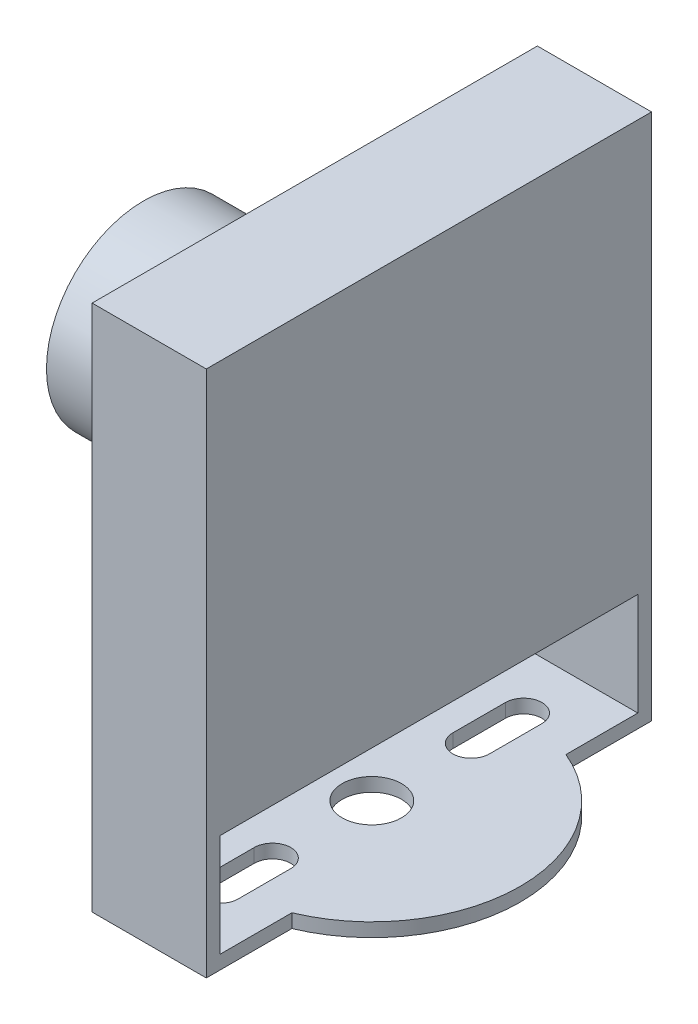
ISO-10303-21;
HEADER;
FILE_DESCRIPTION(('STEP AP214'),'2;1');
FILE_NAME('part.step','',(''),(''),'','','');
FILE_SCHEMA(('AUTOMOTIVE_DESIGN { 1 0 10303 214 1 1 1 1 }'));
ENDSEC;
DATA;
#1=APPLICATION_CONTEXT('core data for automotive mechanical design processes');
#2=APPLICATION_PROTOCOL_DEFINITION('international standard','automotive_design',2000,#1);
#3=PRODUCT_CONTEXT('',#1,'mechanical');
#4=PRODUCT('Part','Part','',(#3));
#5=PRODUCT_RELATED_PRODUCT_CATEGORY('part','',(#4));
#6=PRODUCT_DEFINITION_FORMATION('','',#4);
#7=PRODUCT_DEFINITION_CONTEXT('part definition',#1,'design');
#8=PRODUCT_DEFINITION('design','',#6,#7);
#9=PRODUCT_DEFINITION_SHAPE('','',#8);
#10=(LENGTH_UNIT() NAMED_UNIT(*) SI_UNIT(.MILLI.,.METRE.));
#11=(NAMED_UNIT(*) PLANE_ANGLE_UNIT() SI_UNIT($,.RADIAN.));
#12=(NAMED_UNIT(*) SI_UNIT($,.STERADIAN.) SOLID_ANGLE_UNIT());
#13=UNCERTAINTY_MEASURE_WITH_UNIT(LENGTH_MEASURE(1.E-05),#10,'distance_accuracy_value','');
#14=(GEOMETRIC_REPRESENTATION_CONTEXT(3) GLOBAL_UNCERTAINTY_ASSIGNED_CONTEXT((#13)) GLOBAL_UNIT_ASSIGNED_CONTEXT((#10,
#11,#12)) REPRESENTATION_CONTEXT('',''));
#15=CARTESIAN_POINT('',(0.,0.,0.));
#16=DIRECTION('',(0.,0.,1.));
#17=DIRECTION('',(1.,0.,0.));
#18=AXIS2_PLACEMENT_3D('',#15,#16,#17);
#19=CARTESIAN_POINT('',(-5.,0.,19.5));
#20=DIRECTION('',(-1.,0.,0.));
#21=DIRECTION('',(0.,0.,1.));
#22=AXIS2_PLACEMENT_3D('',#19,#20,#21);
#23=PLANE('',#22);
#24=DIRECTION('',(0.,-1.,0.));
#25=VECTOR('',#24,1.);
#26=CARTESIAN_POINT('',(-5.,1.2,-12.));
#27=LINE('',#26,#25);
#28=CARTESIAN_POINT('',(-5.,1.2,-12.));
#29=VERTEX_POINT('',#28);
#30=CARTESIAN_POINT('',(-5.,0.,-12.));
#31=VERTEX_POINT('',#30);
#32=EDGE_CURVE('E435',#29,#31,#27,.T.);
#33=ORIENTED_EDGE('',*,*,#32,.F.);
#34=DIRECTION('',(0.,0.,1.));
#35=VECTOR('',#34,1.);
#36=CARTESIAN_POINT('',(-5.,1.2,19.5));
#37=LINE('',#36,#35);
#38=CARTESIAN_POINT('',(-5.,1.2,-18.3));
#39=VERTEX_POINT('',#38);
#40=EDGE_CURVE('E415',#39,#29,#37,.T.);
#41=ORIENTED_EDGE('',*,*,#40,.F.);
#42=DIRECTION('',(0.,-1.,0.));
#43=VECTOR('',#42,1.);
#44=CARTESIAN_POINT('',(-5.,46.2,-18.3));
#45=LINE('',#44,#43);
#46=CARTESIAN_POINT('',(-4.99999999999999,10.2,-18.3));
#47=VERTEX_POINT('',#46);
#48=EDGE_CURVE('E390',#47,#39,#45,.T.);
#49=ORIENTED_EDGE('',*,*,#48,.F.);
#50=DIRECTION('',(0.,0.,-1.));
#51=VECTOR('',#50,1.);
#52=CARTESIAN_POINT('',(-4.99999999999999,10.2,55.6630833845388));
#53=LINE('',#52,#51);
#54=CARTESIAN_POINT('',(-5.,10.2,18.3));
#55=VERTEX_POINT('',#54);
#56=EDGE_CURVE('E350',#55,#47,#53,.T.);
#57=ORIENTED_EDGE('',*,*,#56,.F.);
#58=DIRECTION('',(0.,-1.,0.));
#59=VECTOR('',#58,1.);
#60=CARTESIAN_POINT('',(-5.,46.2,18.3));
#61=LINE('',#60,#59);
#62=CARTESIAN_POINT('',(-5.,1.2,18.3));
#63=VERTEX_POINT('',#62);
#64=EDGE_CURVE('E363',#55,#63,#61,.T.);
#65=ORIENTED_EDGE('',*,*,#64,.T.);
#66=CARTESIAN_POINT('',(-5.,1.2,12.));
#67=VERTEX_POINT('',#66);
#68=EDGE_CURVE('E414',#67,#63,#37,.T.);
#69=ORIENTED_EDGE('',*,*,#68,.F.);
#70=DIRECTION('',(0.,-1.,0.));
#71=VECTOR('',#70,1.);
#72=CARTESIAN_POINT('',(-5.,1.2,12.));
#73=LINE('',#72,#71);
#74=CARTESIAN_POINT('',(-5.,0.,12.));
#75=VERTEX_POINT('',#74);
#76=EDGE_CURVE('E422',#75,#67,#73,.F.);
#77=ORIENTED_EDGE('',*,*,#76,.F.);
#78=DIRECTION('',(0.,0.,1.));
#79=VECTOR('',#78,1.);
#80=CARTESIAN_POINT('',(-5.,0.,19.5));
#81=LINE('',#80,#79);
#82=CARTESIAN_POINT('',(-5.,0.,19.5));
#83=VERTEX_POINT('',#82);
#84=EDGE_CURVE('E402',#75,#83,#81,.T.);
#85=ORIENTED_EDGE('',*,*,#84,.T.);
#86=DIRECTION('',(0.,1.,0.));
#87=VECTOR('',#86,1.);
#88=CARTESIAN_POINT('',(-5.,0.,19.5));
#89=LINE('',#88,#87);
#90=CARTESIAN_POINT('',(-5.,46.2,19.5));
#91=VERTEX_POINT('',#90);
#92=EDGE_CURVE('E423',#83,#91,#89,.T.);
#93=ORIENTED_EDGE('',*,*,#92,.T.);
#94=DIRECTION('',(0.,0.,1.));
#95=VECTOR('',#94,1.);
#96=CARTESIAN_POINT('',(-5.,46.2,-19.5));
#97=LINE('',#96,#95);
#98=CARTESIAN_POINT('',(-5.,46.2,-19.5));
#99=VERTEX_POINT('',#98);
#100=EDGE_CURVE('E373',#99,#91,#97,.T.);
#101=ORIENTED_EDGE('',*,*,#100,.F.);
#102=DIRECTION('',(0.,1.,0.));
#103=VECTOR('',#102,1.);
#104=CARTESIAN_POINT('',(-5.,0.,-19.5));
#105=LINE('',#104,#103);
#106=CARTESIAN_POINT('',(-5.,0.,-19.5));
#107=VERTEX_POINT('',#106);
#108=EDGE_CURVE('E427',#107,#99,#105,.T.);
#109=ORIENTED_EDGE('',*,*,#108,.F.);
#110=EDGE_CURVE('E403',#107,#31,#81,.T.);
#111=ORIENTED_EDGE('',*,*,#110,.T.);
#112=EDGE_LOOP('',(#33,#41,#49,#57,#65,#69,#77,#85,#93,#101,#109,#111));
#113=FACE_BOUND('',#112,.T.);
#114=DIRECTION('',(0.,0.,-1.));
#115=VECTOR('',#114,1.);
#116=CARTESIAN_POINT('',(-5.,40.7,-12.5));
#117=LINE('',#116,#115);
#118=CARTESIAN_POINT('',(-5.,40.7,12.5));
#119=VERTEX_POINT('',#118);
#120=CARTESIAN_POINT('',(-5.,40.7,-12.5));
#121=VERTEX_POINT('',#120);
#122=EDGE_CURVE('E322',#119,#121,#117,.T.);
#123=ORIENTED_EDGE('',*,*,#122,.F.);
#124=DIRECTION('',(0.,1.,0.));
#125=VECTOR('',#124,1.);
#126=CARTESIAN_POINT('',(-5.,15.7,12.5));
#127=LINE('',#126,#125);
#128=CARTESIAN_POINT('',(-5.,15.7,12.5));
#129=VERTEX_POINT('',#128);
#130=EDGE_CURVE('E302',#129,#119,#127,.T.);
#131=ORIENTED_EDGE('',*,*,#130,.F.);
#132=DIRECTION('',(0.,0.,1.));
#133=VECTOR('',#132,1.);
#134=CARTESIAN_POINT('',(-5.,15.7,-12.5));
#135=LINE('',#134,#133);
#136=CARTESIAN_POINT('',(-5.,15.7,-12.5));
#137=VERTEX_POINT('',#136);
#138=EDGE_CURVE('E309',#137,#129,#135,.T.);
#139=ORIENTED_EDGE('',*,*,#138,.F.);
#140=DIRECTION('',(0.,-1.,0.));
#141=VECTOR('',#140,1.);
#142=CARTESIAN_POINT('',(-5.,15.7,-12.5));
#143=LINE('',#142,#141);
#144=EDGE_CURVE('E325',#121,#137,#143,.T.);
#145=ORIENTED_EDGE('',*,*,#144,.F.);
#146=EDGE_LOOP('',(#123,#131,#139,#145));
#147=FACE_BOUND('',#146,.T.);
#148=ADVANCED_FACE('F45',(#113,#147),#23,.T.);
#149=CARTESIAN_POINT('',(-5.,46.2,-18.3));
#150=DIRECTION('',(0.,0.,-1.));
#151=DIRECTION('',(-1.,0.,0.));
#152=AXIS2_PLACEMENT_3D('',#149,#150,#151);
#153=PLANE('',#152);
#154=DIRECTION('',(1.,0.,0.));
#155=VECTOR('',#154,1.);
#156=CARTESIAN_POINT('',(-4.99999999999999,10.2,-18.3));
#157=LINE('',#156,#155);
#158=CARTESIAN_POINT('',(5.,10.2,-18.3));
#159=VERTEX_POINT('',#158);
#160=EDGE_CURVE('E344',#47,#159,#157,.T.);
#161=ORIENTED_EDGE('',*,*,#160,.F.);
#162=ORIENTED_EDGE('',*,*,#48,.T.);
#163=DIRECTION('',(1.,0.,0.));
#164=VECTOR('',#163,1.);
#165=CARTESIAN_POINT('',(-5.,1.2,-18.3));
#166=LINE('',#165,#164);
#167=CARTESIAN_POINT('',(5.,1.2,-18.3));
#168=VERTEX_POINT('',#167);
#169=EDGE_CURVE('E372',#39,#168,#166,.T.);
#170=ORIENTED_EDGE('',*,*,#169,.T.);
#171=DIRECTION('',(0.,-1.,0.));
#172=VECTOR('',#171,1.);
#173=CARTESIAN_POINT('',(5.,46.2,-18.3));
#174=LINE('',#173,#172);
#175=EDGE_CURVE('E384',#159,#168,#174,.T.);
#176=ORIENTED_EDGE('',*,*,#175,.F.);
#177=EDGE_LOOP('',(#161,#162,#170,#176));
#178=FACE_BOUND('',#177,.T.);
#179=ADVANCED_FACE('F485',(#178),#153,.F.);
#180=CARTESIAN_POINT('',(-5.,46.2,18.3));
#181=DIRECTION('',(0.,0.,-1.));
#182=DIRECTION('',(-1.,0.,0.));
#183=AXIS2_PLACEMENT_3D('',#180,#181,#182);
#184=PLANE('',#183);
#185=ORIENTED_EDGE('',*,*,#64,.F.);
#186=DIRECTION('',(-1.,0.,0.));
#187=VECTOR('',#186,1.);
#188=CARTESIAN_POINT('',(-4.99999999999999,10.2,18.3));
#189=LINE('',#188,#187);
#190=CARTESIAN_POINT('',(5.,10.2,18.3));
#191=VERTEX_POINT('',#190);
#192=EDGE_CURVE('E345',#191,#55,#189,.T.);
#193=ORIENTED_EDGE('',*,*,#192,.F.);
#194=DIRECTION('',(0.,-1.,0.));
#195=VECTOR('',#194,1.);
#196=CARTESIAN_POINT('',(5.,46.2,18.3));
#197=LINE('',#196,#195);
#198=CARTESIAN_POINT('',(5.,1.2,18.3));
#199=VERTEX_POINT('',#198);
#200=EDGE_CURVE('E369',#191,#199,#197,.T.);
#201=ORIENTED_EDGE('',*,*,#200,.T.);
#202=DIRECTION('',(1.,0.,0.));
#203=VECTOR('',#202,1.);
#204=CARTESIAN_POINT('',(-5.,1.2,18.3));
#205=LINE('',#204,#203);
#206=EDGE_CURVE('E349',#63,#199,#205,.T.);
#207=ORIENTED_EDGE('',*,*,#206,.F.);
#208=EDGE_LOOP('',(#185,#193,#201,#207));
#209=FACE_BOUND('',#208,.T.);
#210=ADVANCED_FACE('F519',(#209),#184,.T.);
#211=CARTESIAN_POINT('',(0.,1.2,0.));
#212=DIRECTION('',(0.,-1.,0.));
#213=DIRECTION('',(0.,0.,-1.));
#214=AXIS2_PLACEMENT_3D('',#211,#212,#213);
#215=CYLINDRICAL_SURFACE('',#214,13.);
#216=CARTESIAN_POINT('',(0.,1.2,0.));
#217=DIRECTION('',(0.,1.,0.));
#218=DIRECTION('',(0.,0.,1.));
#219=AXIS2_PLACEMENT_3D('',#216,#217,#218);
#220=CIRCLE('',#219,13.);
#221=CARTESIAN_POINT('',(5.,1.2,12.));
#222=VERTEX_POINT('',#221);
#223=CARTESIAN_POINT('',(5.,1.2,-12.));
#224=VERTEX_POINT('',#223);
#225=EDGE_CURVE('E55',#222,#224,#220,.T.);
#226=ORIENTED_EDGE('',*,*,#225,.F.);
#227=DIRECTION('',(0.,-1.,0.));
#228=VECTOR('',#227,1.);
#229=CARTESIAN_POINT('',(5.,1.2,12.));
#230=LINE('',#229,#228);
#231=CARTESIAN_POINT('',(5.,0.,12.));
#232=VERTEX_POINT('',#231);
#233=EDGE_CURVE('E443',#222,#232,#230,.T.);
#234=ORIENTED_EDGE('',*,*,#233,.T.);
#235=CARTESIAN_POINT('',(0.,0.,0.));
#236=DIRECTION('',(0.,1.,0.));
#237=DIRECTION('',(0.,0.,1.));
#238=AXIS2_PLACEMENT_3D('',#235,#236,#237);
#239=CIRCLE('',#238,13.);
#240=CARTESIAN_POINT('',(5.,0.,-12.));
#241=VERTEX_POINT('',#240);
#242=EDGE_CURVE('E49',#232,#241,#239,.T.);
#243=ORIENTED_EDGE('',*,*,#242,.T.);
#244=DIRECTION('',(0.,-1.,0.));
#245=VECTOR('',#244,1.);
#246=CARTESIAN_POINT('',(5.,1.2,-12.));
#247=LINE('',#246,#245);
#248=EDGE_CURVE('E439',#241,#224,#247,.F.);
#249=ORIENTED_EDGE('',*,*,#248,.T.);
#250=EDGE_LOOP('',(#226,#234,#243,#249));
#251=FACE_BOUND('',#250,.T.);
#252=ADVANCED_FACE('F580',(#251),#215,.T.);
#253=EDGE_CURVE('E449',#29,#67,#220,.T.);
#254=ORIENTED_EDGE('',*,*,#253,.F.);
#255=ORIENTED_EDGE('',*,*,#32,.T.);
#256=EDGE_CURVE('E446',#31,#75,#239,.T.);
#257=ORIENTED_EDGE('',*,*,#256,.T.);
#258=ORIENTED_EDGE('',*,*,#76,.T.);
#259=EDGE_LOOP('',(#254,#255,#257,#258));
#260=FACE_BOUND('',#259,.T.);
#261=ADVANCED_FACE('F47',(#260),#215,.T.);
#262=CARTESIAN_POINT('',(0.,1.2,0.));
#263=DIRECTION('',(0.,1.,0.));
#264=DIRECTION('',(0.,0.,1.));
#265=AXIS2_PLACEMENT_3D('',#262,#263,#264);
#266=PLANE('',#265);
#267=CARTESIAN_POINT('',(0.,1.2,-8.7));
#268=DIRECTION('',(0.,1.,0.));
#269=DIRECTION('',(0.,0.,1.));
#270=AXIS2_PLACEMENT_3D('',#267,#268,#269);
#271=CIRCLE('',#270,1.6);
#272=CARTESIAN_POINT('',(1.6,1.2,-8.7));
#273=VERTEX_POINT('',#272);
#274=CARTESIAN_POINT('',(-1.6,1.2,-8.7));
#275=VERTEX_POINT('',#274);
#276=EDGE_CURVE('E253',#273,#275,#271,.F.);
#277=ORIENTED_EDGE('',*,*,#276,.T.);
#278=DIRECTION('',(0.,0.,-1.));
#279=VECTOR('',#278,1.);
#280=CARTESIAN_POINT('',(-1.6,1.2,-8.7));
#281=LINE('',#280,#279);
#282=CARTESIAN_POINT('',(-1.6,1.2,-13.3));
#283=VERTEX_POINT('',#282);
#284=EDGE_CURVE('E262',#275,#283,#281,.T.);
#285=ORIENTED_EDGE('',*,*,#284,.T.);
#286=CARTESIAN_POINT('',(0.,1.2,-13.3));
#287=DIRECTION('',(0.,1.,0.));
#288=DIRECTION('',(0.,0.,1.));
#289=AXIS2_PLACEMENT_3D('',#286,#287,#288);
#290=CIRCLE('',#289,1.6);
#291=CARTESIAN_POINT('',(1.6,1.2,-13.3));
#292=VERTEX_POINT('',#291);
#293=EDGE_CURVE('E267',#283,#292,#290,.F.);
#294=ORIENTED_EDGE('',*,*,#293,.T.);
#295=DIRECTION('',(0.,0.,1.));
#296=VECTOR('',#295,1.);
#297=CARTESIAN_POINT('',(1.6,1.2,-8.7));
#298=LINE('',#297,#296);
#299=EDGE_CURVE('E259',#292,#273,#298,.T.);
#300=ORIENTED_EDGE('',*,*,#299,.T.);
#301=EDGE_LOOP('',(#277,#285,#294,#300));
#302=FACE_BOUND('',#301,.T.);
#303=CARTESIAN_POINT('',(0.,1.2,8.7));
#304=DIRECTION('',(0.,1.,0.));
#305=DIRECTION('',(0.,0.,1.));
#306=AXIS2_PLACEMENT_3D('',#303,#304,#305);
#307=CIRCLE('',#306,1.6);
#308=CARTESIAN_POINT('',(-1.6,1.2,8.7));
#309=VERTEX_POINT('',#308);
#310=CARTESIAN_POINT('',(1.6,1.2,8.7));
#311=VERTEX_POINT('',#310);
#312=EDGE_CURVE('E221',#309,#311,#307,.F.);
#313=ORIENTED_EDGE('',*,*,#312,.T.);
#314=DIRECTION('',(0.,0.,1.));
#315=VECTOR('',#314,1.);
#316=CARTESIAN_POINT('',(1.6,1.2,8.7));
#317=LINE('',#316,#315);
#318=CARTESIAN_POINT('',(1.6,1.2,13.3));
#319=VERTEX_POINT('',#318);
#320=EDGE_CURVE('E208',#311,#319,#317,.T.);
#321=ORIENTED_EDGE('',*,*,#320,.T.);
#322=CARTESIAN_POINT('',(0.,1.2,13.3));
#323=DIRECTION('',(0.,1.,0.));
#324=DIRECTION('',(0.,0.,1.));
#325=AXIS2_PLACEMENT_3D('',#322,#323,#324);
#326=CIRCLE('',#325,1.6);
#327=CARTESIAN_POINT('',(-1.6,1.2,13.3));
#328=VERTEX_POINT('',#327);
#329=EDGE_CURVE('E768',#319,#328,#326,.F.);
#330=ORIENTED_EDGE('',*,*,#329,.T.);
#331=DIRECTION('',(0.,0.,-1.));
#332=VECTOR('',#331,1.);
#333=CARTESIAN_POINT('',(-1.6,1.2,8.7));
#334=LINE('',#333,#332);
#335=EDGE_CURVE('E226',#328,#309,#334,.T.);
#336=ORIENTED_EDGE('',*,*,#335,.T.);
#337=EDGE_LOOP('',(#313,#321,#330,#336));
#338=FACE_BOUND('',#337,.T.);
#339=CARTESIAN_POINT('',(0.,1.2,0.));
#340=DIRECTION('',(0.,1.,0.));
#341=DIRECTION('',(0.,0.,1.));
#342=AXIS2_PLACEMENT_3D('',#339,#340,#341);
#343=CIRCLE('',#342,2.6);
#344=CARTESIAN_POINT('',(0.,1.2,2.6));
#345=VERTEX_POINT('',#344);
#346=EDGE_CURVE('E232',#345,#345,#343,.F.);
#347=ORIENTED_EDGE('',*,*,#346,.T.);
#348=EDGE_LOOP('',(#347));
#349=FACE_BOUND('',#348,.T.);
#350=ORIENTED_EDGE('',*,*,#206,.T.);
#351=DIRECTION('',(0.,0.,-1.));
#352=VECTOR('',#351,1.);
#353=CARTESIAN_POINT('',(5.,1.2,19.5));
#354=LINE('',#353,#352);
#355=EDGE_CURVE('E411',#199,#222,#354,.T.);
#356=ORIENTED_EDGE('',*,*,#355,.T.);
#357=ORIENTED_EDGE('',*,*,#225,.T.);
#358=EDGE_CURVE('E393',#224,#168,#354,.T.);
#359=ORIENTED_EDGE('',*,*,#358,.T.);
#360=ORIENTED_EDGE('',*,*,#169,.F.);
#361=ORIENTED_EDGE('',*,*,#40,.T.);
#362=ORIENTED_EDGE('',*,*,#253,.T.);
#363=ORIENTED_EDGE('',*,*,#68,.T.);
#364=EDGE_LOOP('',(#350,#356,#357,#359,#360,#361,#362,#363));
#365=FACE_BOUND('',#364,.T.);
#366=ADVANCED_FACE('F229',(#302,#338,#349,#365),#266,.T.);
#367=CARTESIAN_POINT('',(0.,0.,0.));
#368=DIRECTION('',(0.,1.,0.));
#369=DIRECTION('',(0.,0.,1.));
#370=AXIS2_PLACEMENT_3D('',#367,#368,#369);
#371=PLANE('',#370);
#372=DIRECTION('',(0.,0.,-1.));
#373=VECTOR('',#372,1.);
#374=CARTESIAN_POINT('',(-1.6,0.,-8.7));
#375=LINE('',#374,#373);
#376=CARTESIAN_POINT('',(-1.6,0.,-8.7));
#377=VERTEX_POINT('',#376);
#378=CARTESIAN_POINT('',(-1.6,0.,-13.3));
#379=VERTEX_POINT('',#378);
#380=EDGE_CURVE('E282',#377,#379,#375,.T.);
#381=ORIENTED_EDGE('',*,*,#380,.F.);
#382=CARTESIAN_POINT('',(0.,0.,-8.7));
#383=DIRECTION('',(0.,-1.,0.));
#384=DIRECTION('',(0.,0.,1.));
#385=AXIS2_PLACEMENT_3D('',#382,#383,#384);
#386=CIRCLE('',#385,1.6);
#387=CARTESIAN_POINT('',(1.6,0.,-8.7));
#388=VERTEX_POINT('',#387);
#389=EDGE_CURVE('E263',#388,#377,#386,.T.);
#390=ORIENTED_EDGE('',*,*,#389,.F.);
#391=DIRECTION('',(0.,0.,1.));
#392=VECTOR('',#391,1.);
#393=CARTESIAN_POINT('',(1.6,0.,-8.7));
#394=LINE('',#393,#392);
#395=CARTESIAN_POINT('',(1.6,0.,-13.3));
#396=VERTEX_POINT('',#395);
#397=EDGE_CURVE('E289',#396,#388,#394,.T.);
#398=ORIENTED_EDGE('',*,*,#397,.F.);
#399=CARTESIAN_POINT('',(0.,0.,-13.3));
#400=DIRECTION('',(0.,-1.,0.));
#401=DIRECTION('',(0.,0.,1.));
#402=AXIS2_PLACEMENT_3D('',#399,#400,#401);
#403=CIRCLE('',#402,1.6);
#404=EDGE_CURVE('E285',#379,#396,#403,.T.);
#405=ORIENTED_EDGE('',*,*,#404,.F.);
#406=EDGE_LOOP('',(#381,#390,#398,#405));
#407=FACE_BOUND('',#406,.T.);
#408=DIRECTION('',(0.,0.,1.));
#409=VECTOR('',#408,1.);
#410=CARTESIAN_POINT('',(1.6,0.,8.7));
#411=LINE('',#410,#409);
#412=CARTESIAN_POINT('',(1.6,0.,8.7));
#413=VERTEX_POINT('',#412);
#414=CARTESIAN_POINT('',(1.6,0.,13.3));
#415=VERTEX_POINT('',#414);
#416=EDGE_CURVE('E243',#413,#415,#411,.T.);
#417=ORIENTED_EDGE('',*,*,#416,.F.);
#418=CARTESIAN_POINT('',(0.,0.,8.7));
#419=DIRECTION('',(0.,-1.,0.));
#420=DIRECTION('',(0.,0.,-1.));
#421=AXIS2_PLACEMENT_3D('',#418,#419,#420);
#422=CIRCLE('',#421,1.6);
#423=CARTESIAN_POINT('',(-1.6,0.,8.7));
#424=VERTEX_POINT('',#423);
#425=EDGE_CURVE('E224',#424,#413,#422,.T.);
#426=ORIENTED_EDGE('',*,*,#425,.F.);
#427=DIRECTION('',(0.,0.,-1.));
#428=VECTOR('',#427,1.);
#429=CARTESIAN_POINT('',(-1.6,0.,8.7));
#430=LINE('',#429,#428);
#431=CARTESIAN_POINT('',(-1.6,0.,13.3));
#432=VERTEX_POINT('',#431);
#433=EDGE_CURVE('E250',#432,#424,#430,.T.);
#434=ORIENTED_EDGE('',*,*,#433,.F.);
#435=CARTESIAN_POINT('',(0.,0.,13.3));
#436=DIRECTION('',(0.,-1.,0.));
#437=DIRECTION('',(0.,0.,-1.));
#438=AXIS2_PLACEMENT_3D('',#435,#436,#437);
#439=CIRCLE('',#438,1.6);
#440=EDGE_CURVE('E246',#415,#432,#439,.T.);
#441=ORIENTED_EDGE('',*,*,#440,.F.);
#442=EDGE_LOOP('',(#417,#426,#434,#441));
#443=FACE_BOUND('',#442,.T.);
#444=CARTESIAN_POINT('',(0.,0.,0.));
#445=DIRECTION('',(0.,-1.,0.));
#446=DIRECTION('',(0.,0.,-1.));
#447=AXIS2_PLACEMENT_3D('',#444,#445,#446);
#448=CIRCLE('',#447,2.6);
#449=CARTESIAN_POINT('',(0.,0.,-2.6));
#450=VERTEX_POINT('',#449);
#451=EDGE_CURVE('E236',#450,#450,#448,.T.);
#452=ORIENTED_EDGE('',*,*,#451,.F.);
#453=EDGE_LOOP('',(#452));
#454=FACE_BOUND('',#453,.T.);
#455=ORIENTED_EDGE('',*,*,#256,.F.);
#456=ORIENTED_EDGE('',*,*,#110,.F.);
#457=DIRECTION('',(-1.,0.,0.));
#458=VECTOR('',#457,1.);
#459=CARTESIAN_POINT('',(-5.,0.,-19.5));
#460=LINE('',#459,#458);
#461=CARTESIAN_POINT('',(5.,0.,-19.5));
#462=VERTEX_POINT('',#461);
#463=EDGE_CURVE('E397',#462,#107,#460,.T.);
#464=ORIENTED_EDGE('',*,*,#463,.F.);
#465=DIRECTION('',(0.,0.,-1.));
#466=VECTOR('',#465,1.);
#467=CARTESIAN_POINT('',(5.,0.,19.5));
#468=LINE('',#467,#466);
#469=EDGE_CURVE('E398',#241,#462,#468,.T.);
#470=ORIENTED_EDGE('',*,*,#469,.F.);
#471=ORIENTED_EDGE('',*,*,#242,.F.);
#472=CARTESIAN_POINT('',(5.,0.,19.5));
#473=VERTEX_POINT('',#472);
#474=EDGE_CURVE('E394',#473,#232,#468,.T.);
#475=ORIENTED_EDGE('',*,*,#474,.F.);
#476=DIRECTION('',(1.,0.,0.));
#477=VECTOR('',#476,1.);
#478=CARTESIAN_POINT('',(-5.,0.,19.5));
#479=LINE('',#478,#477);
#480=EDGE_CURVE('E406',#83,#473,#479,.T.);
#481=ORIENTED_EDGE('',*,*,#480,.F.);
#482=ORIENTED_EDGE('',*,*,#84,.F.);
#483=EDGE_LOOP('',(#455,#456,#464,#470,#471,#475,#481,#482));
#484=FACE_BOUND('',#483,.T.);
#485=ADVANCED_FACE('F469',(#407,#443,#454,#484),#371,.F.);
#486=CARTESIAN_POINT('',(-5.,0.,-19.5));
#487=DIRECTION('',(0.,0.,-1.));
#488=DIRECTION('',(-1.,0.,0.));
#489=AXIS2_PLACEMENT_3D('',#486,#487,#488);
#490=PLANE('',#489);
#491=ORIENTED_EDGE('',*,*,#108,.T.);
#492=DIRECTION('',(-1.,0.,0.));
#493=VECTOR('',#492,1.);
#494=CARTESIAN_POINT('',(-5.,46.2,-19.5));
#495=LINE('',#494,#493);
#496=CARTESIAN_POINT('',(5.,46.2,-19.5));
#497=VERTEX_POINT('',#496);
#498=EDGE_CURVE('E380',#497,#99,#495,.T.);
#499=ORIENTED_EDGE('',*,*,#498,.F.);
#500=DIRECTION('',(0.,1.,0.));
#501=VECTOR('',#500,1.);
#502=CARTESIAN_POINT('',(5.,0.,-19.5));
#503=LINE('',#502,#501);
#504=EDGE_CURVE('E410',#462,#497,#503,.T.);
#505=ORIENTED_EDGE('',*,*,#504,.F.);
#506=ORIENTED_EDGE('',*,*,#463,.T.);
#507=EDGE_LOOP('',(#491,#499,#505,#506));
#508=FACE_BOUND('',#507,.T.);
#509=ADVANCED_FACE('F492',(#508),#490,.T.);
#510=CARTESIAN_POINT('',(5.,0.,19.5));
#511=DIRECTION('',(1.,0.,0.));
#512=DIRECTION('',(0.,0.,-1.));
#513=AXIS2_PLACEMENT_3D('',#510,#511,#512);
#514=PLANE('',#513);
#515=ORIENTED_EDGE('',*,*,#233,.F.);
#516=ORIENTED_EDGE('',*,*,#355,.F.);
#517=ORIENTED_EDGE('',*,*,#200,.F.);
#518=DIRECTION('',(0.,0.,-1.));
#519=VECTOR('',#518,1.);
#520=CARTESIAN_POINT('',(5.,10.2,55.6630833845388));
#521=LINE('',#520,#519);
#522=EDGE_CURVE('E354',#191,#159,#521,.T.);
#523=ORIENTED_EDGE('',*,*,#522,.T.);
#524=ORIENTED_EDGE('',*,*,#175,.T.);
#525=ORIENTED_EDGE('',*,*,#358,.F.);
#526=ORIENTED_EDGE('',*,*,#248,.F.);
#527=ORIENTED_EDGE('',*,*,#469,.T.);
#528=ORIENTED_EDGE('',*,*,#504,.T.);
#529=DIRECTION('',(0.,0.,-1.));
#530=VECTOR('',#529,1.);
#531=CARTESIAN_POINT('',(5.,46.2,-19.5));
#532=LINE('',#531,#530);
#533=CARTESIAN_POINT('',(5.,46.2,19.5));
#534=VERTEX_POINT('',#533);
#535=EDGE_CURVE('E376',#534,#497,#532,.T.);
#536=ORIENTED_EDGE('',*,*,#535,.F.);
#537=DIRECTION('',(0.,1.,0.));
#538=VECTOR('',#537,1.);
#539=CARTESIAN_POINT('',(5.,0.,19.5));
#540=LINE('',#539,#538);
#541=EDGE_CURVE('E418',#473,#534,#540,.T.);
#542=ORIENTED_EDGE('',*,*,#541,.F.);
#543=ORIENTED_EDGE('',*,*,#474,.T.);
#544=EDGE_LOOP('',(#515,#516,#517,#523,#524,#525,#526,#527,#528,#536,#542,#543));
#545=FACE_BOUND('',#544,.T.);
#546=ADVANCED_FACE('F498',(#545),#514,.T.);
#547=CARTESIAN_POINT('',(-5.,0.,19.5));
#548=DIRECTION('',(0.,0.,1.));
#549=DIRECTION('',(1.,0.,0.));
#550=AXIS2_PLACEMENT_3D('',#547,#548,#549);
#551=PLANE('',#550);
#552=ORIENTED_EDGE('',*,*,#541,.T.);
#553=DIRECTION('',(-1.,0.,0.));
#554=VECTOR('',#553,1.);
#555=CARTESIAN_POINT('',(-5.,46.2,19.5));
#556=LINE('',#555,#554);
#557=EDGE_CURVE('E359',#534,#91,#556,.T.);
#558=ORIENTED_EDGE('',*,*,#557,.T.);
#559=ORIENTED_EDGE('',*,*,#92,.F.);
#560=ORIENTED_EDGE('',*,*,#480,.T.);
#561=EDGE_LOOP('',(#552,#558,#559,#560));
#562=FACE_BOUND('',#561,.T.);
#563=ADVANCED_FACE('F500',(#562),#551,.T.);
#564=CARTESIAN_POINT('',(0.,46.2,0.));
#565=DIRECTION('',(0.,1.,0.));
#566=DIRECTION('',(0.,0.,1.));
#567=AXIS2_PLACEMENT_3D('',#564,#565,#566);
#568=PLANE('',#567);
#569=ORIENTED_EDGE('',*,*,#100,.T.);
#570=ORIENTED_EDGE('',*,*,#557,.F.);
#571=ORIENTED_EDGE('',*,*,#535,.T.);
#572=ORIENTED_EDGE('',*,*,#498,.T.);
#573=EDGE_LOOP('',(#569,#570,#571,#572));
#574=FACE_BOUND('',#573,.T.);
#575=ADVANCED_FACE('F495',(#574),#568,.T.);
#576=CARTESIAN_POINT('',(-4.99999999999999,10.2,55.6630833845388));
#577=DIRECTION('',(0.,1.,0.));
#578=DIRECTION('',(0.,0.,1.));
#579=AXIS2_PLACEMENT_3D('',#576,#577,#578);
#580=PLANE('',#579);
#581=ORIENTED_EDGE('',*,*,#522,.F.);
#582=ORIENTED_EDGE('',*,*,#192,.T.);
#583=ORIENTED_EDGE('',*,*,#56,.T.);
#584=ORIENTED_EDGE('',*,*,#160,.T.);
#585=EDGE_LOOP('',(#581,#582,#583,#584));
#586=FACE_BOUND('',#585,.T.);
#587=ADVANCED_FACE('F508',(#586),#580,.F.);
#588=CARTESIAN_POINT('',(-8.,15.7,12.5));
#589=DIRECTION('',(0.,0.,-1.));
#590=DIRECTION('',(0.,1.,0.));
#591=AXIS2_PLACEMENT_3D('',#588,#589,#590);
#592=PLANE('',#591);
#593=ORIENTED_EDGE('',*,*,#130,.T.);
#594=DIRECTION('',(1.,0.,0.));
#595=VECTOR('',#594,1.);
#596=CARTESIAN_POINT('',(-8.,40.7,12.5));
#597=LINE('',#596,#595);
#598=CARTESIAN_POINT('',(-8.,40.7,12.5));
#599=VERTEX_POINT('',#598);
#600=EDGE_CURVE('E341',#599,#119,#597,.T.);
#601=ORIENTED_EDGE('',*,*,#600,.F.);
#602=DIRECTION('',(0.,1.,0.));
#603=VECTOR('',#602,1.);
#604=CARTESIAN_POINT('',(-8.,15.7,12.5));
#605=LINE('',#604,#603);
#606=CARTESIAN_POINT('',(-8.,15.7,12.5));
#607=VERTEX_POINT('',#606);
#608=EDGE_CURVE('E304',#607,#599,#605,.T.);
#609=ORIENTED_EDGE('',*,*,#608,.F.);
#610=DIRECTION('',(1.,0.,0.));
#611=VECTOR('',#610,1.);
#612=CARTESIAN_POINT('',(-8.,15.7,12.5));
#613=LINE('',#612,#611);
#614=EDGE_CURVE('E318',#607,#129,#613,.T.);
#615=ORIENTED_EDGE('',*,*,#614,.T.);
#616=EDGE_LOOP('',(#593,#601,#609,#615));
#617=FACE_BOUND('',#616,.T.);
#618=ADVANCED_FACE('F573',(#617),#592,.F.);
#619=CARTESIAN_POINT('',(-8.,40.7,-12.5));
#620=DIRECTION('',(0.,-1.,0.));
#621=DIRECTION('',(0.,0.,-1.));
#622=AXIS2_PLACEMENT_3D('',#619,#620,#621);
#623=PLANE('',#622);
#624=ORIENTED_EDGE('',*,*,#122,.T.);
#625=DIRECTION('',(1.,0.,0.));
#626=VECTOR('',#625,1.);
#627=CARTESIAN_POINT('',(-8.,40.7,-12.5));
#628=LINE('',#627,#626);
#629=CARTESIAN_POINT('',(-8.,40.7,-12.5));
#630=VERTEX_POINT('',#629);
#631=EDGE_CURVE('E337',#630,#121,#628,.T.);
#632=ORIENTED_EDGE('',*,*,#631,.F.);
#633=DIRECTION('',(0.,0.,-1.));
#634=VECTOR('',#633,1.);
#635=CARTESIAN_POINT('',(-8.,40.7,-12.5));
#636=LINE('',#635,#634);
#637=EDGE_CURVE('E308',#599,#630,#636,.T.);
#638=ORIENTED_EDGE('',*,*,#637,.F.);
#639=ORIENTED_EDGE('',*,*,#600,.T.);
#640=EDGE_LOOP('',(#624,#632,#638,#639));
#641=FACE_BOUND('',#640,.T.);
#642=ADVANCED_FACE('F569',(#641),#623,.F.);
#643=CARTESIAN_POINT('',(-8.,15.7,-12.5));
#644=DIRECTION('',(0.,0.,1.));
#645=DIRECTION('',(1.,0.,0.));
#646=AXIS2_PLACEMENT_3D('',#643,#644,#645);
#647=PLANE('',#646);
#648=ORIENTED_EDGE('',*,*,#144,.T.);
#649=DIRECTION('',(1.,0.,0.));
#650=VECTOR('',#649,1.);
#651=CARTESIAN_POINT('',(-8.,15.7,-12.5));
#652=LINE('',#651,#650);
#653=CARTESIAN_POINT('',(-8.,15.7,-12.5));
#654=VERTEX_POINT('',#653);
#655=EDGE_CURVE('E334',#654,#137,#652,.T.);
#656=ORIENTED_EDGE('',*,*,#655,.F.);
#657=DIRECTION('',(0.,-1.,0.));
#658=VECTOR('',#657,1.);
#659=CARTESIAN_POINT('',(-8.,15.7,-12.5));
#660=LINE('',#659,#658);
#661=EDGE_CURVE('E312',#630,#654,#660,.T.);
#662=ORIENTED_EDGE('',*,*,#661,.F.);
#663=ORIENTED_EDGE('',*,*,#631,.T.);
#664=EDGE_LOOP('',(#648,#656,#662,#663));
#665=FACE_BOUND('',#664,.T.);
#666=ADVANCED_FACE('F565',(#665),#647,.F.);
#667=CARTESIAN_POINT('',(-8.,15.7,-12.5));
#668=DIRECTION('',(0.,1.,0.));
#669=DIRECTION('',(0.,0.,1.));
#670=AXIS2_PLACEMENT_3D('',#667,#668,#669);
#671=PLANE('',#670);
#672=ORIENTED_EDGE('',*,*,#138,.T.);
#673=ORIENTED_EDGE('',*,*,#614,.F.);
#674=DIRECTION('',(0.,0.,1.));
#675=VECTOR('',#674,1.);
#676=CARTESIAN_POINT('',(-8.,15.7,-12.5));
#677=LINE('',#676,#675);
#678=EDGE_CURVE('E315',#654,#607,#677,.T.);
#679=ORIENTED_EDGE('',*,*,#678,.F.);
#680=ORIENTED_EDGE('',*,*,#655,.T.);
#681=EDGE_LOOP('',(#672,#673,#679,#680));
#682=FACE_BOUND('',#681,.T.);
#683=ADVANCED_FACE('F561',(#682),#671,.F.);
#684=CARTESIAN_POINT('',(-8.,0.,0.));
#685=DIRECTION('',(1.,0.,0.));
#686=DIRECTION('',(0.,0.,-1.));
#687=AXIS2_PLACEMENT_3D('',#684,#685,#686);
#688=PLANE('',#687);
#689=CARTESIAN_POINT('',(-8.,28.2,0.));
#690=DIRECTION('',(-1.,0.,0.));
#691=DIRECTION('',(0.,0.,1.));
#692=AXIS2_PLACEMENT_3D('',#689,#690,#691);
#693=CIRCLE('',#692,8.5);
#694=CARTESIAN_POINT('',(-8.,28.2,8.5));
#695=VERTEX_POINT('',#694);
#696=EDGE_CURVE('E11',#695,#695,#693,.T.);
#697=ORIENTED_EDGE('',*,*,#696,.F.);
#698=EDGE_LOOP('',(#697));
#699=FACE_BOUND('',#698,.T.);
#700=ORIENTED_EDGE('',*,*,#608,.T.);
#701=ORIENTED_EDGE('',*,*,#637,.T.);
#702=ORIENTED_EDGE('',*,*,#661,.T.);
#703=ORIENTED_EDGE('',*,*,#678,.T.);
#704=EDGE_LOOP('',(#700,#701,#702,#703));
#705=FACE_BOUND('',#704,.T.);
#706=ADVANCED_FACE('F557',(#699,#705),#688,.F.);
#707=CARTESIAN_POINT('',(-20.,28.2,0.));
#708=DIRECTION('',(1.,0.,0.));
#709=DIRECTION('',(0.,0.,-1.));
#710=AXIS2_PLACEMENT_3D('',#707,#708,#709);
#711=CYLINDRICAL_SURFACE('',#710,8.5);
#712=CARTESIAN_POINT('',(-20.,28.2,0.));
#713=DIRECTION('',(-1.,0.,0.));
#714=DIRECTION('',(0.,0.,1.));
#715=AXIS2_PLACEMENT_3D('',#712,#713,#714);
#716=CIRCLE('',#715,8.5);
#717=CARTESIAN_POINT('',(-20.,28.2,8.5));
#718=VERTEX_POINT('',#717);
#719=EDGE_CURVE('E299',#718,#718,#716,.T.);
#720=ORIENTED_EDGE('',*,*,#719,.F.);
#721=EDGE_LOOP('',(#720));
#722=FACE_BOUND('',#721,.T.);
#723=ORIENTED_EDGE('',*,*,#696,.T.);
#724=EDGE_LOOP('',(#723));
#725=FACE_BOUND('',#724,.T.);
#726=ADVANCED_FACE('F547',(#722,#725),#711,.T.);
#727=CARTESIAN_POINT('',(-20.,28.2,0.));
#728=DIRECTION('',(-1.,0.,0.));
#729=DIRECTION('',(0.,0.,1.));
#730=AXIS2_PLACEMENT_3D('',#727,#728,#729);
#731=PLANE('',#730);
#732=ORIENTED_EDGE('',*,*,#719,.T.);
#733=EDGE_LOOP('',(#732));
#734=FACE_BOUND('',#733,.T.);
#735=ADVANCED_FACE('F538',(#734),#731,.T.);
#736=CARTESIAN_POINT('',(0.,46.201,0.));
#737=DIRECTION('',(0.,-1.,0.));
#738=DIRECTION('',(0.,0.,-1.));
#739=AXIS2_PLACEMENT_3D('',#736,#737,#738);
#740=CYLINDRICAL_SURFACE('',#739,2.6);
#741=ORIENTED_EDGE('',*,*,#346,.F.);
#742=EDGE_LOOP('',(#741));
#743=FACE_BOUND('',#742,.T.);
#744=ORIENTED_EDGE('',*,*,#451,.T.);
#745=EDGE_LOOP('',(#744));
#746=FACE_BOUND('',#745,.T.);
#747=ADVANCED_FACE('F537',(#743,#746),#740,.F.);
#748=CARTESIAN_POINT('',(0.,46.201,8.7));
#749=DIRECTION('',(0.,-1.,0.));
#750=DIRECTION('',(0.,0.,-1.));
#751=AXIS2_PLACEMENT_3D('',#748,#749,#750);
#752=CYLINDRICAL_SURFACE('',#751,1.6);
#753=DIRECTION('',(0.,-1.,0.));
#754=VECTOR('',#753,1.);
#755=CARTESIAN_POINT('',(-1.6,46.201,8.7));
#756=LINE('',#755,#754);
#757=EDGE_CURVE('E771',#309,#424,#756,.T.);
#758=ORIENTED_EDGE('',*,*,#757,.T.);
#759=ORIENTED_EDGE('',*,*,#425,.T.);
#760=DIRECTION('',(0.,-1.,0.));
#761=VECTOR('',#760,1.);
#762=CARTESIAN_POINT('',(1.6,46.201,8.7));
#763=LINE('',#762,#761);
#764=EDGE_CURVE('E211',#311,#413,#763,.T.);
#765=ORIENTED_EDGE('',*,*,#764,.F.);
#766=ORIENTED_EDGE('',*,*,#312,.F.);
#767=EDGE_LOOP('',(#758,#759,#765,#766));
#768=FACE_BOUND('',#767,.T.);
#769=ADVANCED_FACE('F220',(#768),#752,.F.);
#770=CARTESIAN_POINT('',(-1.6,46.201,8.7));
#771=DIRECTION('',(-1.,0.,0.));
#772=DIRECTION('',(0.,0.,1.));
#773=AXIS2_PLACEMENT_3D('',#770,#771,#772);
#774=PLANE('',#773);
#775=DIRECTION('',(0.,-1.,0.));
#776=VECTOR('',#775,1.);
#777=CARTESIAN_POINT('',(-1.6,46.201,13.3));
#778=LINE('',#777,#776);
#779=EDGE_CURVE('E217',#328,#432,#778,.T.);
#780=ORIENTED_EDGE('',*,*,#779,.T.);
#781=ORIENTED_EDGE('',*,*,#433,.T.);
#782=ORIENTED_EDGE('',*,*,#757,.F.);
#783=ORIENTED_EDGE('',*,*,#335,.F.);
#784=EDGE_LOOP('',(#780,#781,#782,#783));
#785=FACE_BOUND('',#784,.T.);
#786=ADVANCED_FACE('F544',(#785),#774,.F.);
#787=CARTESIAN_POINT('',(0.,46.201,13.3));
#788=DIRECTION('',(0.,-1.,0.));
#789=DIRECTION('',(0.,0.,-1.));
#790=AXIS2_PLACEMENT_3D('',#787,#788,#789);
#791=CYLINDRICAL_SURFACE('',#790,1.6);
#792=DIRECTION('',(0.,-1.,0.));
#793=VECTOR('',#792,1.);
#794=CARTESIAN_POINT('',(1.6,46.201,13.3));
#795=LINE('',#794,#793);
#796=EDGE_CURVE('E71',#319,#415,#795,.T.);
#797=ORIENTED_EDGE('',*,*,#796,.T.);
#798=ORIENTED_EDGE('',*,*,#440,.T.);
#799=ORIENTED_EDGE('',*,*,#779,.F.);
#800=ORIENTED_EDGE('',*,*,#329,.F.);
#801=EDGE_LOOP('',(#797,#798,#799,#800));
#802=FACE_BOUND('',#801,.T.);
#803=ADVANCED_FACE('F703',(#802),#791,.F.);
#804=CARTESIAN_POINT('',(1.6,46.201,8.7));
#805=DIRECTION('',(1.,0.,0.));
#806=DIRECTION('',(0.,0.,-1.));
#807=AXIS2_PLACEMENT_3D('',#804,#805,#806);
#808=PLANE('',#807);
#809=ORIENTED_EDGE('',*,*,#764,.T.);
#810=ORIENTED_EDGE('',*,*,#416,.T.);
#811=ORIENTED_EDGE('',*,*,#796,.F.);
#812=ORIENTED_EDGE('',*,*,#320,.F.);
#813=EDGE_LOOP('',(#809,#810,#811,#812));
#814=FACE_BOUND('',#813,.T.);
#815=ADVANCED_FACE('F210',(#814),#808,.F.);
#816=CARTESIAN_POINT('',(0.,46.201,-8.7));
#817=DIRECTION('',(0.,-1.,0.));
#818=DIRECTION('',(0.,0.,-1.));
#819=AXIS2_PLACEMENT_3D('',#816,#817,#818);
#820=CYLINDRICAL_SURFACE('',#819,1.6);
#821=DIRECTION('',(0.,-1.,0.));
#822=VECTOR('',#821,1.);
#823=CARTESIAN_POINT('',(1.6,46.201,-8.7));
#824=LINE('',#823,#822);
#825=EDGE_CURVE('E268',#273,#388,#824,.T.);
#826=ORIENTED_EDGE('',*,*,#825,.T.);
#827=ORIENTED_EDGE('',*,*,#389,.T.);
#828=DIRECTION('',(0.,-1.,0.));
#829=VECTOR('',#828,1.);
#830=CARTESIAN_POINT('',(-1.6,46.201,-8.7));
#831=LINE('',#830,#829);
#832=EDGE_CURVE('E255',#275,#377,#831,.T.);
#833=ORIENTED_EDGE('',*,*,#832,.F.);
#834=ORIENTED_EDGE('',*,*,#276,.F.);
#835=EDGE_LOOP('',(#826,#827,#833,#834));
#836=FACE_BOUND('',#835,.T.);
#837=ADVANCED_FACE('F720',(#836),#820,.F.);
#838=CARTESIAN_POINT('',(1.6,46.201,-8.7));
#839=DIRECTION('',(1.,0.,0.));
#840=DIRECTION('',(0.,0.,-1.));
#841=AXIS2_PLACEMENT_3D('',#838,#839,#840);
#842=PLANE('',#841);
#843=DIRECTION('',(0.,-1.,0.));
#844=VECTOR('',#843,1.);
#845=CARTESIAN_POINT('',(1.6,46.201,-13.3));
#846=LINE('',#845,#844);
#847=EDGE_CURVE('E264',#292,#396,#846,.T.);
#848=ORIENTED_EDGE('',*,*,#847,.T.);
#849=ORIENTED_EDGE('',*,*,#397,.T.);
#850=ORIENTED_EDGE('',*,*,#825,.F.);
#851=ORIENTED_EDGE('',*,*,#299,.F.);
#852=EDGE_LOOP('',(#848,#849,#850,#851));
#853=FACE_BOUND('',#852,.T.);
#854=ADVANCED_FACE('F728',(#853),#842,.F.);
#855=CARTESIAN_POINT('',(0.,46.201,-13.3));
#856=DIRECTION('',(0.,-1.,0.));
#857=DIRECTION('',(0.,0.,-1.));
#858=AXIS2_PLACEMENT_3D('',#855,#856,#857);
#859=CYLINDRICAL_SURFACE('',#858,1.6);
#860=DIRECTION('',(0.,-1.,0.));
#861=VECTOR('',#860,1.);
#862=CARTESIAN_POINT('',(-1.6,46.201,-13.3));
#863=LINE('',#862,#861);
#864=EDGE_CURVE('E63',#283,#379,#863,.T.);
#865=ORIENTED_EDGE('',*,*,#864,.T.);
#866=ORIENTED_EDGE('',*,*,#404,.T.);
#867=ORIENTED_EDGE('',*,*,#847,.F.);
#868=ORIENTED_EDGE('',*,*,#293,.F.);
#869=EDGE_LOOP('',(#865,#866,#867,#868));
#870=FACE_BOUND('',#869,.T.);
#871=ADVANCED_FACE('F737',(#870),#859,.F.);
#872=CARTESIAN_POINT('',(-1.6,46.201,-8.7));
#873=DIRECTION('',(-1.,0.,0.));
#874=DIRECTION('',(0.,0.,1.));
#875=AXIS2_PLACEMENT_3D('',#872,#873,#874);
#876=PLANE('',#875);
#877=ORIENTED_EDGE('',*,*,#832,.T.);
#878=ORIENTED_EDGE('',*,*,#380,.T.);
#879=ORIENTED_EDGE('',*,*,#864,.F.);
#880=ORIENTED_EDGE('',*,*,#284,.F.);
#881=EDGE_LOOP('',(#877,#878,#879,#880));
#882=FACE_BOUND('',#881,.T.);
#883=ADVANCED_FACE('F552',(#882),#876,.F.);
#884=CLOSED_SHELL('',(#148,#179,#210,#252,#261,#366,#485,#509,#546,#563,#575,#587,#618,#642,
#666,#683,#706,#726,#735,#747,#769,#786,#803,#815,#837,#854,#871,#883));
#885=MANIFOLD_SOLID_BREP('B2',#884);
#886=ADVANCED_BREP_SHAPE_REPRESENTATION('',(#18,#885),#14);
#887=SHAPE_DEFINITION_REPRESENTATION(#9,#886);
ENDSEC;
END-ISO-10303-21;
